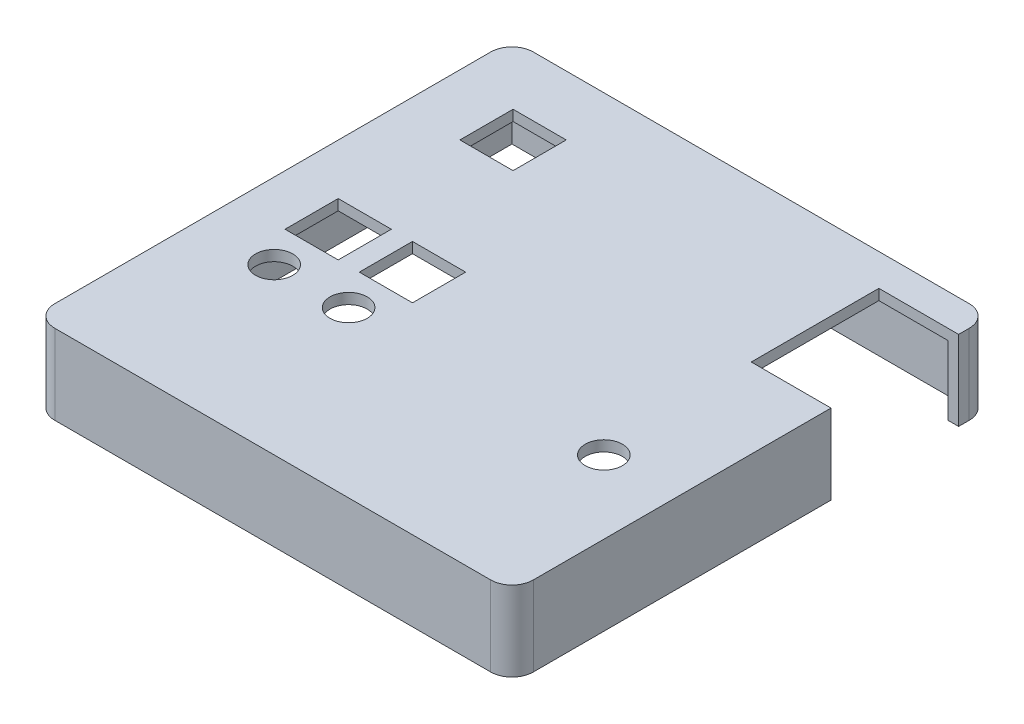
ISO-10303-21;
HEADER;
FILE_DESCRIPTION(('STEP AP214'),'2;1');
FILE_NAME('part.step','',(''),(''),'','','');
FILE_SCHEMA(('AUTOMOTIVE_DESIGN { 1 0 10303 214 1 1 1 1 }'));
ENDSEC;
DATA;
#1=APPLICATION_CONTEXT('core data for automotive mechanical design processes');
#2=APPLICATION_PROTOCOL_DEFINITION('international standard','automotive_design',2000,#1);
#3=PRODUCT_CONTEXT('',#1,'mechanical');
#4=PRODUCT('Part','Part','',(#3));
#5=PRODUCT_RELATED_PRODUCT_CATEGORY('part','',(#4));
#6=PRODUCT_DEFINITION_FORMATION('','',#4);
#7=PRODUCT_DEFINITION_CONTEXT('part definition',#1,'design');
#8=PRODUCT_DEFINITION('design','',#6,#7);
#9=PRODUCT_DEFINITION_SHAPE('','',#8);
#10=(LENGTH_UNIT() NAMED_UNIT(*) SI_UNIT(.MILLI.,.METRE.));
#11=(NAMED_UNIT(*) PLANE_ANGLE_UNIT() SI_UNIT($,.RADIAN.));
#12=(NAMED_UNIT(*) SI_UNIT($,.STERADIAN.) SOLID_ANGLE_UNIT());
#13=UNCERTAINTY_MEASURE_WITH_UNIT(LENGTH_MEASURE(1.E-05),#10,'distance_accuracy_value','');
#14=(GEOMETRIC_REPRESENTATION_CONTEXT(3) GLOBAL_UNCERTAINTY_ASSIGNED_CONTEXT((#13)) GLOBAL_UNIT_ASSIGNED_CONTEXT((#10,
#11,#12)) REPRESENTATION_CONTEXT('',''));
#15=CARTESIAN_POINT('',(0.,0.,0.));
#16=DIRECTION('',(0.,0.,1.));
#17=DIRECTION('',(1.,0.,0.));
#18=AXIS2_PLACEMENT_3D('',#15,#16,#17);
#19=CARTESIAN_POINT('',(0.,-15.,0.));
#20=DIRECTION('',(0.,-1.,0.));
#21=DIRECTION('',(0.,0.,-1.));
#22=AXIS2_PLACEMENT_3D('',#19,#20,#21);
#23=PLANE('',#22);
#24=DIRECTION('',(0.,0.,1.));
#25=VECTOR('',#24,1.);
#26=CARTESIAN_POINT('',(0.,-15.,0.));
#27=LINE('',#26,#25);
#28=CARTESIAN_POINT('',(0.,-15.,-86.));
#29=VERTEX_POINT('',#28);
#30=CARTESIAN_POINT('',(0.,-15.,-4.));
#31=VERTEX_POINT('',#30);
#32=EDGE_CURVE('E453',#29,#31,#27,.T.);
#33=ORIENTED_EDGE('',*,*,#32,.F.);
#34=CARTESIAN_POINT('',(4.,-15.,-86.));
#35=DIRECTION('',(0.,-1.,0.));
#36=DIRECTION('',(0.,0.,-1.));
#37=AXIS2_PLACEMENT_3D('',#34,#35,#36);
#38=CIRCLE('',#37,4.);
#39=CARTESIAN_POINT('',(4.,-15.,-90.));
#40=VERTEX_POINT('',#39);
#41=EDGE_CURVE('E563',#29,#40,#38,.T.);
#42=ORIENTED_EDGE('',*,*,#41,.T.);
#43=DIRECTION('',(-1.,0.,0.));
#44=VECTOR('',#43,1.);
#45=CARTESIAN_POINT('',(0.,-15.,-90.));
#46=LINE('',#45,#44);
#47=CARTESIAN_POINT('',(86.,-15.,-90.));
#48=VERTEX_POINT('',#47);
#49=EDGE_CURVE('E465',#48,#40,#46,.T.);
#50=ORIENTED_EDGE('',*,*,#49,.F.);
#51=CARTESIAN_POINT('',(86.,-15.,-86.));
#52=DIRECTION('',(0.,-1.,0.));
#53=DIRECTION('',(0.,0.,-1.));
#54=AXIS2_PLACEMENT_3D('',#51,#52,#53);
#55=CIRCLE('',#54,4.);
#56=CARTESIAN_POINT('',(90.,-15.,-86.));
#57=VERTEX_POINT('',#56);
#58=EDGE_CURVE('E55',#48,#57,#55,.T.);
#59=ORIENTED_EDGE('',*,*,#58,.T.);
#60=DIRECTION('',(0.,0.,-1.));
#61=VECTOR('',#60,1.);
#62=CARTESIAN_POINT('',(90.,-15.,0.));
#63=LINE('',#62,#61);
#64=CARTESIAN_POINT('',(90.,-15.,-84.));
#65=VERTEX_POINT('',#64);
#66=EDGE_CURVE('E461',#65,#57,#63,.T.);
#67=ORIENTED_EDGE('',*,*,#66,.F.);
#68=DIRECTION('',(1.,0.,0.));
#69=VECTOR('',#68,1.);
#70=CARTESIAN_POINT('',(75.,-15.,-84.));
#71=LINE('',#70,#69);
#72=CARTESIAN_POINT('',(88.,-15.,-84.));
#73=VERTEX_POINT('',#72);
#74=EDGE_CURVE('E447',#73,#65,#71,.T.);
#75=ORIENTED_EDGE('',*,*,#74,.F.);
#76=DIRECTION('',(0.,0.,-1.));
#77=VECTOR('',#76,1.);
#78=CARTESIAN_POINT('',(88.,-15.,0.));
#79=LINE('',#78,#77);
#80=CARTESIAN_POINT('',(88.,-15.,-88.));
#81=VERTEX_POINT('',#80);
#82=EDGE_CURVE('E395',#73,#81,#79,.T.);
#83=ORIENTED_EDGE('',*,*,#82,.T.);
#84=DIRECTION('',(-1.,0.,0.));
#85=VECTOR('',#84,1.);
#86=CARTESIAN_POINT('',(0.,-15.,-88.));
#87=LINE('',#86,#85);
#88=CARTESIAN_POINT('',(2.,-15.,-88.));
#89=VERTEX_POINT('',#88);
#90=EDGE_CURVE('E368',#81,#89,#87,.T.);
#91=ORIENTED_EDGE('',*,*,#90,.T.);
#92=DIRECTION('',(0.,0.,1.));
#93=VECTOR('',#92,1.);
#94=CARTESIAN_POINT('',(2.,-15.,0.));
#95=LINE('',#94,#93);
#96=CARTESIAN_POINT('',(2.,-15.,-2.));
#97=VERTEX_POINT('',#96);
#98=EDGE_CURVE('E380',#89,#97,#95,.T.);
#99=ORIENTED_EDGE('',*,*,#98,.T.);
#100=DIRECTION('',(1.,0.,0.));
#101=VECTOR('',#100,1.);
#102=CARTESIAN_POINT('',(0.,-15.,-2.));
#103=LINE('',#102,#101);
#104=CARTESIAN_POINT('',(88.,-15.,-2.));
#105=VERTEX_POINT('',#104);
#106=EDGE_CURVE('E396',#97,#105,#103,.T.);
#107=ORIENTED_EDGE('',*,*,#106,.T.);
#108=DIRECTION('',(0.,0.,-1.));
#109=VECTOR('',#108,1.);
#110=CARTESIAN_POINT('',(88.,-15.,0.));
#111=LINE('',#110,#109);
#112=CARTESIAN_POINT('',(88.,-15.,-60.));
#113=VERTEX_POINT('',#112);
#114=EDGE_CURVE('E391',#105,#113,#111,.T.);
#115=ORIENTED_EDGE('',*,*,#114,.T.);
#116=DIRECTION('',(1.,0.,0.));
#117=VECTOR('',#116,1.);
#118=CARTESIAN_POINT('',(75.,-15.,-60.));
#119=LINE('',#118,#117);
#120=CARTESIAN_POINT('',(90.,-15.,-60.));
#121=VERTEX_POINT('',#120);
#122=EDGE_CURVE('E432',#113,#121,#119,.T.);
#123=ORIENTED_EDGE('',*,*,#122,.T.);
#124=CARTESIAN_POINT('',(90.,-15.,-4.));
#125=VERTEX_POINT('',#124);
#126=EDGE_CURVE('E462',#125,#121,#63,.T.);
#127=ORIENTED_EDGE('',*,*,#126,.F.);
#128=CARTESIAN_POINT('',(86.,-15.,-4.));
#129=DIRECTION('',(0.,-1.,0.));
#130=DIRECTION('',(0.,0.,-1.));
#131=AXIS2_PLACEMENT_3D('',#128,#129,#130);
#132=CIRCLE('',#131,4.);
#133=CARTESIAN_POINT('',(86.,-15.,0.));
#134=VERTEX_POINT('',#133);
#135=EDGE_CURVE('E62',#125,#134,#132,.T.);
#136=ORIENTED_EDGE('',*,*,#135,.T.);
#137=DIRECTION('',(1.,0.,0.));
#138=VECTOR('',#137,1.);
#139=CARTESIAN_POINT('',(0.,-15.,0.));
#140=LINE('',#139,#138);
#141=CARTESIAN_POINT('',(4.,-15.,0.));
#142=VERTEX_POINT('',#141);
#143=EDGE_CURVE('E457',#142,#134,#140,.T.);
#144=ORIENTED_EDGE('',*,*,#143,.F.);
#145=CARTESIAN_POINT('',(4.,-15.,-4.));
#146=DIRECTION('',(0.,-1.,0.));
#147=DIRECTION('',(0.,0.,-1.));
#148=AXIS2_PLACEMENT_3D('',#145,#146,#147);
#149=CIRCLE('',#148,4.);
#150=EDGE_CURVE('E560',#142,#31,#149,.T.);
#151=ORIENTED_EDGE('',*,*,#150,.T.);
#152=EDGE_LOOP('',(#33,#42,#50,#59,#67,#75,#83,#91,#99,#107,#115,#123,#127,#136,#144,#151));
#153=FACE_BOUND('',#152,.T.);
#154=ADVANCED_FACE('F39',(#153),#23,.T.);
#155=CARTESIAN_POINT('',(75.,0.,-60.));
#156=DIRECTION('',(0.,0.,1.));
#157=DIRECTION('',(1.,0.,0.));
#158=AXIS2_PLACEMENT_3D('',#155,#156,#157);
#159=PLANE('',#158);
#160=DIRECTION('',(0.,-1.,0.));
#161=VECTOR('',#160,1.);
#162=CARTESIAN_POINT('',(88.,-15.,-60.));
#163=LINE('',#162,#161);
#164=CARTESIAN_POINT('',(88.,-2.,-60.));
#165=VERTEX_POINT('',#164);
#166=EDGE_CURVE('E386',#165,#113,#163,.T.);
#167=ORIENTED_EDGE('',*,*,#166,.F.);
#168=DIRECTION('',(1.,0.,0.));
#169=VECTOR('',#168,1.);
#170=CARTESIAN_POINT('',(75.,-2.,-60.));
#171=LINE('',#170,#169);
#172=CARTESIAN_POINT('',(75.,-2.,-60.));
#173=VERTEX_POINT('',#172);
#174=EDGE_CURVE('E372',#173,#165,#171,.T.);
#175=ORIENTED_EDGE('',*,*,#174,.F.);
#176=DIRECTION('',(0.,-1.,0.));
#177=VECTOR('',#176,1.);
#178=CARTESIAN_POINT('',(75.,0.,-60.));
#179=LINE('',#178,#177);
#180=CARTESIAN_POINT('',(75.,0.,-60.));
#181=VERTEX_POINT('',#180);
#182=EDGE_CURVE('E420',#181,#173,#179,.T.);
#183=ORIENTED_EDGE('',*,*,#182,.F.);
#184=DIRECTION('',(1.,0.,0.));
#185=VECTOR('',#184,1.);
#186=CARTESIAN_POINT('',(75.,0.,-60.));
#187=LINE('',#186,#185);
#188=CARTESIAN_POINT('',(90.,0.,-60.));
#189=VERTEX_POINT('',#188);
#190=EDGE_CURVE('E438',#181,#189,#187,.T.);
#191=ORIENTED_EDGE('',*,*,#190,.T.);
#192=DIRECTION('',(0.,-1.,0.));
#193=VECTOR('',#192,1.);
#194=CARTESIAN_POINT('',(90.,0.,-60.));
#195=LINE('',#194,#193);
#196=EDGE_CURVE('E376',#189,#121,#195,.T.);
#197=ORIENTED_EDGE('',*,*,#196,.T.);
#198=ORIENTED_EDGE('',*,*,#122,.F.);
#199=EDGE_LOOP('',(#167,#175,#183,#191,#197,#198));
#200=FACE_BOUND('',#199,.T.);
#201=ADVANCED_FACE('F608',(#200),#159,.F.);
#202=CARTESIAN_POINT('',(75.,0.,-84.));
#203=DIRECTION('',(0.,0.,-1.));
#204=DIRECTION('',(-1.,0.,0.));
#205=AXIS2_PLACEMENT_3D('',#202,#203,#204);
#206=PLANE('',#205);
#207=DIRECTION('',(0.,1.,0.));
#208=VECTOR('',#207,1.);
#209=CARTESIAN_POINT('',(88.,-15.,-84.));
#210=LINE('',#209,#208);
#211=CARTESIAN_POINT('',(88.,-2.,-84.));
#212=VERTEX_POINT('',#211);
#213=EDGE_CURVE('E389',#73,#212,#210,.T.);
#214=ORIENTED_EDGE('',*,*,#213,.F.);
#215=ORIENTED_EDGE('',*,*,#74,.T.);
#216=DIRECTION('',(0.,1.,0.));
#217=VECTOR('',#216,1.);
#218=CARTESIAN_POINT('',(90.,0.,-84.));
#219=LINE('',#218,#217);
#220=CARTESIAN_POINT('',(90.,0.,-84.));
#221=VERTEX_POINT('',#220);
#222=EDGE_CURVE('E425',#65,#221,#219,.T.);
#223=ORIENTED_EDGE('',*,*,#222,.T.);
#224=DIRECTION('',(1.,0.,0.));
#225=VECTOR('',#224,1.);
#226=CARTESIAN_POINT('',(75.,0.,-84.));
#227=LINE('',#226,#225);
#228=CARTESIAN_POINT('',(75.,0.,-84.));
#229=VERTEX_POINT('',#228);
#230=EDGE_CURVE('E443',#229,#221,#227,.T.);
#231=ORIENTED_EDGE('',*,*,#230,.F.);
#232=DIRECTION('',(0.,1.,0.));
#233=VECTOR('',#232,1.);
#234=CARTESIAN_POINT('',(75.,0.,-84.));
#235=LINE('',#234,#233);
#236=CARTESIAN_POINT('',(75.,-2.,-84.));
#237=VERTEX_POINT('',#236);
#238=EDGE_CURVE('E424',#237,#229,#235,.T.);
#239=ORIENTED_EDGE('',*,*,#238,.F.);
#240=DIRECTION('',(1.,0.,0.));
#241=VECTOR('',#240,1.);
#242=CARTESIAN_POINT('',(0.,-2.,-84.));
#243=LINE('',#242,#241);
#244=EDGE_CURVE('E412',#237,#212,#243,.T.);
#245=ORIENTED_EDGE('',*,*,#244,.T.);
#246=EDGE_LOOP('',(#214,#215,#223,#231,#239,#245));
#247=FACE_BOUND('',#246,.T.);
#248=ADVANCED_FACE('F591',(#247),#206,.F.);
#249=CARTESIAN_POINT('',(90.,-15.,0.));
#250=DIRECTION('',(1.,0.,0.));
#251=DIRECTION('',(0.,0.,-1.));
#252=AXIS2_PLACEMENT_3D('',#249,#250,#251);
#253=PLANE('',#252);
#254=DIRECTION('',(0.,0.,-1.));
#255=VECTOR('',#254,1.);
#256=CARTESIAN_POINT('',(90.,0.,0.));
#257=LINE('',#256,#255);
#258=CARTESIAN_POINT('',(90.,0.,-4.));
#259=VERTEX_POINT('',#258);
#260=EDGE_CURVE('E478',#259,#189,#257,.T.);
#261=ORIENTED_EDGE('',*,*,#260,.F.);
#262=DIRECTION('',(0.,1.,0.));
#263=VECTOR('',#262,1.);
#264=CARTESIAN_POINT('',(90.,-15.,-4.));
#265=LINE('',#264,#263);
#266=EDGE_CURVE('E11',#259,#125,#265,.F.);
#267=ORIENTED_EDGE('',*,*,#266,.T.);
#268=ORIENTED_EDGE('',*,*,#126,.T.);
#269=ORIENTED_EDGE('',*,*,#196,.F.);
#270=EDGE_LOOP('',(#261,#267,#268,#269));
#271=FACE_BOUND('',#270,.T.);
#272=ADVANCED_FACE('F652',(#271),#253,.T.);
#273=CARTESIAN_POINT('',(0.,-15.,0.));
#274=DIRECTION('',(-1.,0.,0.));
#275=DIRECTION('',(0.,0.,1.));
#276=AXIS2_PLACEMENT_3D('',#273,#274,#275);
#277=PLANE('',#276);
#278=DIRECTION('',(0.,0.,1.));
#279=VECTOR('',#278,1.);
#280=CARTESIAN_POINT('',(0.,0.,0.));
#281=LINE('',#280,#279);
#282=CARTESIAN_POINT('',(0.,0.,-86.));
#283=VERTEX_POINT('',#282);
#284=CARTESIAN_POINT('',(0.,0.,-4.));
#285=VERTEX_POINT('',#284);
#286=EDGE_CURVE('E442',#283,#285,#281,.T.);
#287=ORIENTED_EDGE('',*,*,#286,.F.);
#288=DIRECTION('',(0.,1.,0.));
#289=VECTOR('',#288,1.);
#290=CARTESIAN_POINT('',(0.,-15.,-86.));
#291=LINE('',#290,#289);
#292=EDGE_CURVE('E553',#283,#29,#291,.F.);
#293=ORIENTED_EDGE('',*,*,#292,.T.);
#294=ORIENTED_EDGE('',*,*,#32,.T.);
#295=DIRECTION('',(0.,1.,0.));
#296=VECTOR('',#295,1.);
#297=CARTESIAN_POINT('',(0.,-15.,-4.));
#298=LINE('',#297,#296);
#299=EDGE_CURVE('E549',#31,#285,#298,.T.);
#300=ORIENTED_EDGE('',*,*,#299,.T.);
#301=EDGE_LOOP('',(#287,#293,#294,#300));
#302=FACE_BOUND('',#301,.T.);
#303=ADVANCED_FACE('F648',(#302),#277,.T.);
#304=CARTESIAN_POINT('',(0.,-15.,-90.));
#305=DIRECTION('',(0.,0.,-1.));
#306=DIRECTION('',(-1.,0.,0.));
#307=AXIS2_PLACEMENT_3D('',#304,#305,#306);
#308=PLANE('',#307);
#309=ORIENTED_EDGE('',*,*,#49,.T.);
#310=DIRECTION('',(0.,1.,0.));
#311=VECTOR('',#310,1.);
#312=CARTESIAN_POINT('',(4.,-15.,-90.));
#313=LINE('',#312,#311);
#314=CARTESIAN_POINT('',(4.,0.,-90.));
#315=VERTEX_POINT('',#314);
#316=EDGE_CURVE('E533',#40,#315,#313,.T.);
#317=ORIENTED_EDGE('',*,*,#316,.T.);
#318=DIRECTION('',(-1.,0.,0.));
#319=VECTOR('',#318,1.);
#320=CARTESIAN_POINT('',(0.,0.,-90.));
#321=LINE('',#320,#319);
#322=CARTESIAN_POINT('',(86.,0.,-90.));
#323=VERTEX_POINT('',#322);
#324=EDGE_CURVE('E458',#323,#315,#321,.T.);
#325=ORIENTED_EDGE('',*,*,#324,.F.);
#326=DIRECTION('',(0.,1.,0.));
#327=VECTOR('',#326,1.);
#328=CARTESIAN_POINT('',(86.,-15.,-90.));
#329=LINE('',#328,#327);
#330=EDGE_CURVE('E530',#323,#48,#329,.F.);
#331=ORIENTED_EDGE('',*,*,#330,.T.);
#332=EDGE_LOOP('',(#309,#317,#325,#331));
#333=FACE_BOUND('',#332,.T.);
#334=ADVANCED_FACE('F645',(#333),#308,.T.);
#335=ORIENTED_EDGE('',*,*,#66,.T.);
#336=DIRECTION('',(0.,1.,0.));
#337=VECTOR('',#336,1.);
#338=CARTESIAN_POINT('',(90.,-15.,-86.));
#339=LINE('',#338,#337);
#340=CARTESIAN_POINT('',(90.,0.,-86.));
#341=VERTEX_POINT('',#340);
#342=EDGE_CURVE('E48',#57,#341,#339,.T.);
#343=ORIENTED_EDGE('',*,*,#342,.T.);
#344=EDGE_CURVE('E477',#221,#341,#257,.T.);
#345=ORIENTED_EDGE('',*,*,#344,.F.);
#346=ORIENTED_EDGE('',*,*,#222,.F.);
#347=EDGE_LOOP('',(#335,#343,#345,#346));
#348=FACE_BOUND('',#347,.T.);
#349=ADVANCED_FACE('F578',(#348),#253,.T.);
#350=CARTESIAN_POINT('',(0.,-15.,0.));
#351=DIRECTION('',(0.,0.,1.));
#352=DIRECTION('',(1.,0.,0.));
#353=AXIS2_PLACEMENT_3D('',#350,#351,#352);
#354=PLANE('',#353);
#355=DIRECTION('',(1.,0.,0.));
#356=VECTOR('',#355,1.);
#357=CARTESIAN_POINT('',(0.,0.,0.));
#358=LINE('',#357,#356);
#359=CARTESIAN_POINT('',(4.,0.,0.));
#360=VERTEX_POINT('',#359);
#361=CARTESIAN_POINT('',(86.,0.,0.));
#362=VERTEX_POINT('',#361);
#363=EDGE_CURVE('E473',#360,#362,#358,.T.);
#364=ORIENTED_EDGE('',*,*,#363,.F.);
#365=DIRECTION('',(0.,1.,0.));
#366=VECTOR('',#365,1.);
#367=CARTESIAN_POINT('',(4.,-15.,0.));
#368=LINE('',#367,#366);
#369=EDGE_CURVE('E570',#360,#142,#368,.F.);
#370=ORIENTED_EDGE('',*,*,#369,.T.);
#371=ORIENTED_EDGE('',*,*,#143,.T.);
#372=DIRECTION('',(0.,1.,0.));
#373=VECTOR('',#372,1.);
#374=CARTESIAN_POINT('',(86.,-15.,0.));
#375=LINE('',#374,#373);
#376=EDGE_CURVE('E566',#134,#362,#375,.T.);
#377=ORIENTED_EDGE('',*,*,#376,.T.);
#378=EDGE_LOOP('',(#364,#370,#371,#377));
#379=FACE_BOUND('',#378,.T.);
#380=ADVANCED_FACE('F643',(#379),#354,.T.);
#381=CARTESIAN_POINT('',(0.,0.,0.));
#382=DIRECTION('',(0.,-1.,0.));
#383=DIRECTION('',(0.,0.,-1.));
#384=AXIS2_PLACEMENT_3D('',#381,#382,#383);
#385=PLANE('',#384);
#386=DIRECTION('',(-1.,0.,0.));
#387=VECTOR('',#386,1.);
#388=CARTESIAN_POINT('',(11.43,0.,-78.77));
#389=LINE('',#388,#387);
#390=CARTESIAN_POINT('',(21.43,0.,-78.77));
#391=VERTEX_POINT('',#390);
#392=CARTESIAN_POINT('',(11.43,0.,-78.77));
#393=VERTEX_POINT('',#392);
#394=EDGE_CURVE('E285',#391,#393,#389,.T.);
#395=ORIENTED_EDGE('',*,*,#394,.F.);
#396=DIRECTION('',(0.,0.,-1.));
#397=VECTOR('',#396,1.);
#398=CARTESIAN_POINT('',(21.43,0.,-68.77));
#399=LINE('',#398,#397);
#400=CARTESIAN_POINT('',(21.43,0.,-68.77));
#401=VERTEX_POINT('',#400);
#402=EDGE_CURVE('E282',#401,#391,#399,.T.);
#403=ORIENTED_EDGE('',*,*,#402,.F.);
#404=DIRECTION('',(1.,0.,0.));
#405=VECTOR('',#404,1.);
#406=CARTESIAN_POINT('',(11.43,0.,-68.77));
#407=LINE('',#406,#405);
#408=CARTESIAN_POINT('',(11.43,0.,-68.77));
#409=VERTEX_POINT('',#408);
#410=EDGE_CURVE('E293',#409,#401,#407,.T.);
#411=ORIENTED_EDGE('',*,*,#410,.F.);
#412=DIRECTION('',(0.,0.,1.));
#413=VECTOR('',#412,1.);
#414=CARTESIAN_POINT('',(11.43,0.,-68.77));
#415=LINE('',#414,#413);
#416=EDGE_CURVE('E289',#393,#409,#415,.T.);
#417=ORIENTED_EDGE('',*,*,#416,.F.);
#418=EDGE_LOOP('',(#395,#403,#411,#417));
#419=FACE_BOUND('',#418,.T.);
#420=DIRECTION('',(-1.,0.,0.));
#421=VECTOR('',#420,1.);
#422=CARTESIAN_POINT('',(23.5,0.,-47.78));
#423=LINE('',#422,#421);
#424=CARTESIAN_POINT('',(33.5,0.,-47.78));
#425=VERTEX_POINT('',#424);
#426=CARTESIAN_POINT('',(23.5,0.,-47.78));
#427=VERTEX_POINT('',#426);
#428=EDGE_CURVE('E256',#425,#427,#423,.T.);
#429=ORIENTED_EDGE('',*,*,#428,.F.);
#430=DIRECTION('',(0.,0.,-1.));
#431=VECTOR('',#430,1.);
#432=CARTESIAN_POINT('',(33.5,0.,-37.78));
#433=LINE('',#432,#431);
#434=CARTESIAN_POINT('',(33.5,0.,-37.78));
#435=VERTEX_POINT('',#434);
#436=EDGE_CURVE('E262',#435,#425,#433,.T.);
#437=ORIENTED_EDGE('',*,*,#436,.F.);
#438=DIRECTION('',(1.,0.,0.));
#439=VECTOR('',#438,1.);
#440=CARTESIAN_POINT('',(23.5,0.,-37.78));
#441=LINE('',#440,#439);
#442=CARTESIAN_POINT('',(23.5,0.,-37.78));
#443=VERTEX_POINT('',#442);
#444=EDGE_CURVE('E267',#443,#435,#441,.T.);
#445=ORIENTED_EDGE('',*,*,#444,.F.);
#446=DIRECTION('',(0.,0.,1.));
#447=VECTOR('',#446,1.);
#448=CARTESIAN_POINT('',(23.5,0.,-37.78));
#449=LINE('',#448,#447);
#450=EDGE_CURVE('E244',#427,#443,#449,.T.);
#451=ORIENTED_EDGE('',*,*,#450,.F.);
#452=EDGE_LOOP('',(#429,#437,#445,#451));
#453=FACE_BOUND('',#452,.T.);
#454=DIRECTION('',(-1.,0.,0.));
#455=VECTOR('',#454,1.);
#456=CARTESIAN_POINT('',(9.53000000000001,0.,-47.78));
#457=LINE('',#456,#455);
#458=CARTESIAN_POINT('',(19.53,0.,-47.78));
#459=VERTEX_POINT('',#458);
#460=CARTESIAN_POINT('',(9.53000000000001,0.,-47.78));
#461=VERTEX_POINT('',#460);
#462=EDGE_CURVE('E312',#459,#461,#457,.T.);
#463=ORIENTED_EDGE('',*,*,#462,.F.);
#464=DIRECTION('',(0.,0.,-1.));
#465=VECTOR('',#464,1.);
#466=CARTESIAN_POINT('',(19.53,0.,-37.78));
#467=LINE('',#466,#465);
#468=CARTESIAN_POINT('',(19.53,0.,-37.78));
#469=VERTEX_POINT('',#468);
#470=EDGE_CURVE('E277',#469,#459,#467,.T.);
#471=ORIENTED_EDGE('',*,*,#470,.F.);
#472=DIRECTION('',(1.,0.,0.));
#473=VECTOR('',#472,1.);
#474=CARTESIAN_POINT('',(9.53000000000001,0.,-37.78));
#475=LINE('',#474,#473);
#476=CARTESIAN_POINT('',(9.53000000000001,0.,-37.78));
#477=VERTEX_POINT('',#476);
#478=EDGE_CURVE('E320',#477,#469,#475,.T.);
#479=ORIENTED_EDGE('',*,*,#478,.F.);
#480=DIRECTION('',(0.,0.,1.));
#481=VECTOR('',#480,1.);
#482=CARTESIAN_POINT('',(9.53000000000001,0.,-37.78));
#483=LINE('',#482,#481);
#484=EDGE_CURVE('E316',#461,#477,#483,.T.);
#485=ORIENTED_EDGE('',*,*,#484,.F.);
#486=EDGE_LOOP('',(#463,#471,#479,#485));
#487=FACE_BOUND('',#486,.T.);
#488=CARTESIAN_POINT('',(14.27,0.,-31.));
#489=DIRECTION('',(0.,1.,0.));
#490=DIRECTION('',(0.,0.,1.));
#491=AXIS2_PLACEMENT_3D('',#488,#489,#490);
#492=CIRCLE('',#491,3.5);
#493=CARTESIAN_POINT('',(14.27,0.,-27.5));
#494=VERTEX_POINT('',#493);
#495=EDGE_CURVE('E338',#494,#494,#492,.T.);
#496=ORIENTED_EDGE('',*,*,#495,.F.);
#497=EDGE_LOOP('',(#496));
#498=FACE_BOUND('',#497,.T.);
#499=CARTESIAN_POINT('',(28.27,0.,-31.));
#500=DIRECTION('',(0.,1.,0.));
#501=DIRECTION('',(0.,0.,1.));
#502=AXIS2_PLACEMENT_3D('',#499,#500,#501);
#503=CIRCLE('',#502,3.5);
#504=CARTESIAN_POINT('',(28.27,0.,-27.5));
#505=VERTEX_POINT('',#504);
#506=EDGE_CURVE('E343',#505,#505,#503,.T.);
#507=ORIENTED_EDGE('',*,*,#506,.F.);
#508=EDGE_LOOP('',(#507));
#509=FACE_BOUND('',#508,.T.);
#510=CARTESIAN_POINT('',(76.27,0.,-31.));
#511=DIRECTION('',(0.,1.,0.));
#512=DIRECTION('',(0.,0.,1.));
#513=AXIS2_PLACEMENT_3D('',#510,#511,#512);
#514=CIRCLE('',#513,3.50000000000001);
#515=CARTESIAN_POINT('',(76.27,0.,-27.5));
#516=VERTEX_POINT('',#515);
#517=EDGE_CURVE('E328',#516,#516,#514,.T.);
#518=ORIENTED_EDGE('',*,*,#517,.F.);
#519=EDGE_LOOP('',(#518));
#520=FACE_BOUND('',#519,.T.);
#521=ORIENTED_EDGE('',*,*,#324,.T.);
#522=CARTESIAN_POINT('',(4.,0.,-86.));
#523=DIRECTION('',(0.,-1.,0.));
#524=DIRECTION('',(0.,0.,-1.));
#525=AXIS2_PLACEMENT_3D('',#522,#523,#524);
#526=CIRCLE('',#525,4.);
#527=EDGE_CURVE('E546',#315,#283,#526,.F.);
#528=ORIENTED_EDGE('',*,*,#527,.T.);
#529=ORIENTED_EDGE('',*,*,#286,.T.);
#530=CARTESIAN_POINT('',(4.,0.,-4.));
#531=DIRECTION('',(0.,-1.,0.));
#532=DIRECTION('',(0.,0.,-1.));
#533=AXIS2_PLACEMENT_3D('',#530,#531,#532);
#534=CIRCLE('',#533,4.);
#535=EDGE_CURVE('E543',#285,#360,#534,.F.);
#536=ORIENTED_EDGE('',*,*,#535,.T.);
#537=ORIENTED_EDGE('',*,*,#363,.T.);
#538=CARTESIAN_POINT('',(86.,0.,-4.));
#539=DIRECTION('',(0.,-1.,0.));
#540=DIRECTION('',(0.,0.,-1.));
#541=AXIS2_PLACEMENT_3D('',#538,#539,#540);
#542=CIRCLE('',#541,4.);
#543=EDGE_CURVE('E537',#362,#259,#542,.F.);
#544=ORIENTED_EDGE('',*,*,#543,.T.);
#545=ORIENTED_EDGE('',*,*,#260,.T.);
#546=ORIENTED_EDGE('',*,*,#190,.F.);
#547=DIRECTION('',(0.,0.,1.));
#548=VECTOR('',#547,1.);
#549=CARTESIAN_POINT('',(75.,0.,-60.));
#550=LINE('',#549,#548);
#551=EDGE_CURVE('E428',#229,#181,#550,.T.);
#552=ORIENTED_EDGE('',*,*,#551,.F.);
#553=ORIENTED_EDGE('',*,*,#230,.T.);
#554=ORIENTED_EDGE('',*,*,#344,.T.);
#555=CARTESIAN_POINT('',(86.,0.,-86.));
#556=DIRECTION('',(0.,-1.,0.));
#557=DIRECTION('',(0.,0.,-1.));
#558=AXIS2_PLACEMENT_3D('',#555,#556,#557);
#559=CIRCLE('',#558,4.);
#560=EDGE_CURVE('E540',#341,#323,#559,.F.);
#561=ORIENTED_EDGE('',*,*,#560,.T.);
#562=EDGE_LOOP('',(#521,#528,#529,#536,#537,#544,#545,#546,#552,#553,#554,#561));
#563=FACE_BOUND('',#562,.T.);
#564=ADVANCED_FACE('F264',(#419,#453,#487,#498,#509,#520,#563),#385,.F.);
#565=CARTESIAN_POINT('',(75.,0.,0.));
#566=DIRECTION('',(1.,0.,0.));
#567=DIRECTION('',(0.,0.,-1.));
#568=AXIS2_PLACEMENT_3D('',#565,#566,#567);
#569=PLANE('',#568);
#570=DIRECTION('',(0.,0.,1.));
#571=VECTOR('',#570,1.);
#572=CARTESIAN_POINT('',(75.,-2.,0.));
#573=LINE('',#572,#571);
#574=EDGE_CURVE('E411',#237,#173,#573,.T.);
#575=ORIENTED_EDGE('',*,*,#574,.F.);
#576=ORIENTED_EDGE('',*,*,#238,.T.);
#577=ORIENTED_EDGE('',*,*,#551,.T.);
#578=ORIENTED_EDGE('',*,*,#182,.T.);
#579=EDGE_LOOP('',(#575,#576,#577,#578));
#580=FACE_BOUND('',#579,.T.);
#581=ADVANCED_FACE('F605',(#580),#569,.T.);
#582=CARTESIAN_POINT('',(88.,-15.,0.));
#583=DIRECTION('',(1.,0.,0.));
#584=DIRECTION('',(0.,0.,-1.));
#585=AXIS2_PLACEMENT_3D('',#582,#583,#584);
#586=PLANE('',#585);
#587=ORIENTED_EDGE('',*,*,#166,.T.);
#588=ORIENTED_EDGE('',*,*,#114,.F.);
#589=DIRECTION('',(0.,1.,0.));
#590=VECTOR('',#589,1.);
#591=CARTESIAN_POINT('',(88.,-15.,-2.));
#592=LINE('',#591,#590);
#593=CARTESIAN_POINT('',(88.,-2.,-2.));
#594=VERTEX_POINT('',#593);
#595=EDGE_CURVE('E356',#105,#594,#592,.T.);
#596=ORIENTED_EDGE('',*,*,#595,.T.);
#597=DIRECTION('',(0.,0.,-1.));
#598=VECTOR('',#597,1.);
#599=CARTESIAN_POINT('',(88.,-2.,0.));
#600=LINE('',#599,#598);
#601=EDGE_CURVE('E350',#594,#165,#600,.T.);
#602=ORIENTED_EDGE('',*,*,#601,.T.);
#603=EDGE_LOOP('',(#587,#588,#596,#602));
#604=FACE_BOUND('',#603,.T.);
#605=ADVANCED_FACE('F613',(#604),#586,.F.);
#606=CARTESIAN_POINT('',(2.,-15.,0.));
#607=DIRECTION('',(-1.,0.,0.));
#608=DIRECTION('',(0.,0.,1.));
#609=AXIS2_PLACEMENT_3D('',#606,#607,#608);
#610=PLANE('',#609);
#611=DIRECTION('',(0.,0.,1.));
#612=VECTOR('',#611,1.);
#613=CARTESIAN_POINT('',(2.,-2.,0.));
#614=LINE('',#613,#612);
#615=CARTESIAN_POINT('',(2.,-2.,-88.));
#616=VERTEX_POINT('',#615);
#617=CARTESIAN_POINT('',(2.,-2.,-2.));
#618=VERTEX_POINT('',#617);
#619=EDGE_CURVE('E365',#616,#618,#614,.T.);
#620=ORIENTED_EDGE('',*,*,#619,.T.);
#621=DIRECTION('',(0.,1.,0.));
#622=VECTOR('',#621,1.);
#623=CARTESIAN_POINT('',(2.,-15.,-2.));
#624=LINE('',#623,#622);
#625=EDGE_CURVE('E360',#97,#618,#624,.T.);
#626=ORIENTED_EDGE('',*,*,#625,.F.);
#627=ORIENTED_EDGE('',*,*,#98,.F.);
#628=DIRECTION('',(0.,1.,0.));
#629=VECTOR('',#628,1.);
#630=CARTESIAN_POINT('',(2.,-15.,-88.));
#631=LINE('',#630,#629);
#632=EDGE_CURVE('E373',#89,#616,#631,.T.);
#633=ORIENTED_EDGE('',*,*,#632,.T.);
#634=EDGE_LOOP('',(#620,#626,#627,#633));
#635=FACE_BOUND('',#634,.T.);
#636=ADVANCED_FACE('F620',(#635),#610,.F.);
#637=CARTESIAN_POINT('',(0.,-15.,-88.));
#638=DIRECTION('',(0.,0.,-1.));
#639=DIRECTION('',(-1.,0.,0.));
#640=AXIS2_PLACEMENT_3D('',#637,#638,#639);
#641=PLANE('',#640);
#642=DIRECTION('',(-1.,0.,0.));
#643=VECTOR('',#642,1.);
#644=CARTESIAN_POINT('',(0.,-2.,-88.));
#645=LINE('',#644,#643);
#646=CARTESIAN_POINT('',(88.,-2.,-88.));
#647=VERTEX_POINT('',#646);
#648=EDGE_CURVE('E354',#647,#616,#645,.T.);
#649=ORIENTED_EDGE('',*,*,#648,.T.);
#650=ORIENTED_EDGE('',*,*,#632,.F.);
#651=ORIENTED_EDGE('',*,*,#90,.F.);
#652=DIRECTION('',(0.,1.,0.));
#653=VECTOR('',#652,1.);
#654=CARTESIAN_POINT('',(88.,-15.,-88.));
#655=LINE('',#654,#653);
#656=EDGE_CURVE('E359',#81,#647,#655,.T.);
#657=ORIENTED_EDGE('',*,*,#656,.T.);
#658=EDGE_LOOP('',(#649,#650,#651,#657));
#659=FACE_BOUND('',#658,.T.);
#660=ADVANCED_FACE('F623',(#659),#641,.F.);
#661=ORIENTED_EDGE('',*,*,#213,.T.);
#662=DIRECTION('',(0.,0.,-1.));
#663=VECTOR('',#662,1.);
#664=CARTESIAN_POINT('',(88.,-2.,0.));
#665=LINE('',#664,#663);
#666=EDGE_CURVE('E355',#212,#647,#665,.T.);
#667=ORIENTED_EDGE('',*,*,#666,.T.);
#668=ORIENTED_EDGE('',*,*,#656,.F.);
#669=ORIENTED_EDGE('',*,*,#82,.F.);
#670=EDGE_LOOP('',(#661,#667,#668,#669));
#671=FACE_BOUND('',#670,.T.);
#672=ADVANCED_FACE('F596',(#671),#586,.F.);
#673=CARTESIAN_POINT('',(0.,-15.,-2.));
#674=DIRECTION('',(0.,0.,1.));
#675=DIRECTION('',(1.,0.,0.));
#676=AXIS2_PLACEMENT_3D('',#673,#674,#675);
#677=PLANE('',#676);
#678=DIRECTION('',(1.,0.,0.));
#679=VECTOR('',#678,1.);
#680=CARTESIAN_POINT('',(0.,-2.,-2.));
#681=LINE('',#680,#679);
#682=EDGE_CURVE('E361',#618,#594,#681,.T.);
#683=ORIENTED_EDGE('',*,*,#682,.T.);
#684=ORIENTED_EDGE('',*,*,#595,.F.);
#685=ORIENTED_EDGE('',*,*,#106,.F.);
#686=ORIENTED_EDGE('',*,*,#625,.T.);
#687=EDGE_LOOP('',(#683,#684,#685,#686));
#688=FACE_BOUND('',#687,.T.);
#689=ADVANCED_FACE('F617',(#688),#677,.F.);
#690=CARTESIAN_POINT('',(0.,-2.,0.));
#691=DIRECTION('',(0.,-1.,0.));
#692=DIRECTION('',(0.,0.,-1.));
#693=AXIS2_PLACEMENT_3D('',#690,#691,#692);
#694=PLANE('',#693);
#695=DIRECTION('',(0.,0.,1.));
#696=VECTOR('',#695,1.);
#697=CARTESIAN_POINT('',(21.43,-2.,0.));
#698=LINE('',#697,#696);
#699=CARTESIAN_POINT('',(21.43,-2.,-78.77));
#700=VERTEX_POINT('',#699);
#701=CARTESIAN_POINT('',(21.43,-2.,-68.77));
#702=VERTEX_POINT('',#701);
#703=EDGE_CURVE('E527',#700,#702,#698,.T.);
#704=ORIENTED_EDGE('',*,*,#703,.F.);
#705=DIRECTION('',(1.,0.,0.));
#706=VECTOR('',#705,1.);
#707=CARTESIAN_POINT('',(0.,-2.,-78.77));
#708=LINE('',#707,#706);
#709=CARTESIAN_POINT('',(11.43,-2.,-78.77));
#710=VERTEX_POINT('',#709);
#711=EDGE_CURVE('E517',#710,#700,#708,.T.);
#712=ORIENTED_EDGE('',*,*,#711,.F.);
#713=DIRECTION('',(0.,0.,-1.));
#714=VECTOR('',#713,1.);
#715=CARTESIAN_POINT('',(11.43,-2.,0.));
#716=LINE('',#715,#714);
#717=CARTESIAN_POINT('',(11.43,-2.,-68.77));
#718=VERTEX_POINT('',#717);
#719=EDGE_CURVE('E520',#718,#710,#716,.T.);
#720=ORIENTED_EDGE('',*,*,#719,.F.);
#721=DIRECTION('',(-1.,0.,0.));
#722=VECTOR('',#721,1.);
#723=CARTESIAN_POINT('',(0.,-2.,-68.77));
#724=LINE('',#723,#722);
#725=EDGE_CURVE('E524',#702,#718,#724,.T.);
#726=ORIENTED_EDGE('',*,*,#725,.F.);
#727=EDGE_LOOP('',(#704,#712,#720,#726));
#728=FACE_BOUND('',#727,.T.);
#729=DIRECTION('',(0.,0.,1.));
#730=VECTOR('',#729,1.);
#731=CARTESIAN_POINT('',(33.5,-2.,0.));
#732=LINE('',#731,#730);
#733=CARTESIAN_POINT('',(33.5,-2.,-47.78));
#734=VERTEX_POINT('',#733);
#735=CARTESIAN_POINT('',(33.5,-2.,-37.78));
#736=VERTEX_POINT('',#735);
#737=EDGE_CURVE('E514',#734,#736,#732,.T.);
#738=ORIENTED_EDGE('',*,*,#737,.F.);
#739=DIRECTION('',(1.,0.,0.));
#740=VECTOR('',#739,1.);
#741=CARTESIAN_POINT('',(0.,-2.,-47.78));
#742=LINE('',#741,#740);
#743=CARTESIAN_POINT('',(23.5,-2.,-47.78));
#744=VERTEX_POINT('',#743);
#745=EDGE_CURVE('E506',#744,#734,#742,.T.);
#746=ORIENTED_EDGE('',*,*,#745,.F.);
#747=DIRECTION('',(0.,0.,-1.));
#748=VECTOR('',#747,1.);
#749=CARTESIAN_POINT('',(23.5,-2.,0.));
#750=LINE('',#749,#748);
#751=CARTESIAN_POINT('',(23.5,-2.,-37.78));
#752=VERTEX_POINT('',#751);
#753=EDGE_CURVE('E247',#752,#744,#750,.T.);
#754=ORIENTED_EDGE('',*,*,#753,.F.);
#755=DIRECTION('',(-1.,0.,0.));
#756=VECTOR('',#755,1.);
#757=CARTESIAN_POINT('',(0.,-2.,-37.78));
#758=LINE('',#757,#756);
#759=EDGE_CURVE('E511',#736,#752,#758,.T.);
#760=ORIENTED_EDGE('',*,*,#759,.F.);
#761=EDGE_LOOP('',(#738,#746,#754,#760));
#762=FACE_BOUND('',#761,.T.);
#763=DIRECTION('',(0.,0.,1.));
#764=VECTOR('',#763,1.);
#765=CARTESIAN_POINT('',(19.5300000000001,-2.,0.));
#766=LINE('',#765,#764);
#767=CARTESIAN_POINT('',(19.53,-2.,-47.78));
#768=VERTEX_POINT('',#767);
#769=CARTESIAN_POINT('',(19.53,-2.,-37.78));
#770=VERTEX_POINT('',#769);
#771=EDGE_CURVE('E503',#768,#770,#766,.T.);
#772=ORIENTED_EDGE('',*,*,#771,.F.);
#773=DIRECTION('',(1.,0.,0.));
#774=VECTOR('',#773,1.);
#775=CARTESIAN_POINT('',(0.,-2.,-47.78));
#776=LINE('',#775,#774);
#777=CARTESIAN_POINT('',(9.53000000000001,-2.,-47.78));
#778=VERTEX_POINT('',#777);
#779=EDGE_CURVE('E469',#778,#768,#776,.T.);
#780=ORIENTED_EDGE('',*,*,#779,.F.);
#781=DIRECTION('',(0.,0.,-1.));
#782=VECTOR('',#781,1.);
#783=CARTESIAN_POINT('',(9.53000000000001,-2.,0.));
#784=LINE('',#783,#782);
#785=CARTESIAN_POINT('',(9.53000000000001,-2.,-37.78));
#786=VERTEX_POINT('',#785);
#787=EDGE_CURVE('E496',#786,#778,#784,.T.);
#788=ORIENTED_EDGE('',*,*,#787,.F.);
#789=DIRECTION('',(-1.,0.,0.));
#790=VECTOR('',#789,1.);
#791=CARTESIAN_POINT('',(0.,-2.,-37.78));
#792=LINE('',#791,#790);
#793=EDGE_CURVE('E500',#770,#786,#792,.T.);
#794=ORIENTED_EDGE('',*,*,#793,.F.);
#795=EDGE_LOOP('',(#772,#780,#788,#794));
#796=FACE_BOUND('',#795,.T.);
#797=CARTESIAN_POINT('',(14.27,-2.,-31.));
#798=DIRECTION('',(0.,-1.,0.));
#799=DIRECTION('',(0.,0.,-1.));
#800=AXIS2_PLACEMENT_3D('',#797,#798,#799);
#801=CIRCLE('',#800,3.5);
#802=CARTESIAN_POINT('',(14.27,-2.,-34.5));
#803=VERTEX_POINT('',#802);
#804=EDGE_CURVE('E390',#803,#803,#801,.T.);
#805=ORIENTED_EDGE('',*,*,#804,.F.);
#806=EDGE_LOOP('',(#805));
#807=FACE_BOUND('',#806,.T.);
#808=CARTESIAN_POINT('',(28.27,-2.,-31.));
#809=DIRECTION('',(0.,-1.,0.));
#810=DIRECTION('',(0.,0.,-1.));
#811=AXIS2_PLACEMENT_3D('',#808,#809,#810);
#812=CIRCLE('',#811,3.5);
#813=CARTESIAN_POINT('',(28.27,-2.,-34.5));
#814=VERTEX_POINT('',#813);
#815=EDGE_CURVE('E487',#814,#814,#812,.T.);
#816=ORIENTED_EDGE('',*,*,#815,.F.);
#817=EDGE_LOOP('',(#816));
#818=FACE_BOUND('',#817,.T.);
#819=CARTESIAN_POINT('',(76.27,-2.,-31.));
#820=DIRECTION('',(0.,-1.,0.));
#821=DIRECTION('',(0.,0.,-1.));
#822=AXIS2_PLACEMENT_3D('',#819,#820,#821);
#823=CIRCLE('',#822,3.50000000000001);
#824=CARTESIAN_POINT('',(76.27,-2.,-34.5));
#825=VERTEX_POINT('',#824);
#826=EDGE_CURVE('E342',#825,#825,#823,.T.);
#827=ORIENTED_EDGE('',*,*,#826,.F.);
#828=EDGE_LOOP('',(#827));
#829=FACE_BOUND('',#828,.T.);
#830=ORIENTED_EDGE('',*,*,#601,.F.);
#831=ORIENTED_EDGE('',*,*,#682,.F.);
#832=ORIENTED_EDGE('',*,*,#619,.F.);
#833=ORIENTED_EDGE('',*,*,#648,.F.);
#834=ORIENTED_EDGE('',*,*,#666,.F.);
#835=ORIENTED_EDGE('',*,*,#244,.F.);
#836=ORIENTED_EDGE('',*,*,#574,.T.);
#837=ORIENTED_EDGE('',*,*,#174,.T.);
#838=EDGE_LOOP('',(#830,#831,#832,#833,#834,#835,#836,#837));
#839=FACE_BOUND('',#838,.T.);
#840=ADVANCED_FACE('F601',(#728,#762,#796,#807,#818,#829,#839),#694,.T.);
#841=CARTESIAN_POINT('',(76.27,-4.,-31.));
#842=DIRECTION('',(0.,1.,0.));
#843=DIRECTION('',(0.,0.,1.));
#844=AXIS2_PLACEMENT_3D('',#841,#842,#843);
#845=CYLINDRICAL_SURFACE('',#844,3.50000000000001);
#846=ORIENTED_EDGE('',*,*,#826,.T.);
#847=EDGE_LOOP('',(#846));
#848=FACE_BOUND('',#847,.T.);
#849=ORIENTED_EDGE('',*,*,#517,.T.);
#850=EDGE_LOOP('',(#849));
#851=FACE_BOUND('',#850,.T.);
#852=ADVANCED_FACE('F696',(#848,#851),#845,.F.);
#853=CARTESIAN_POINT('',(28.27,-4.,-31.));
#854=DIRECTION('',(0.,1.,0.));
#855=DIRECTION('',(0.,0.,1.));
#856=AXIS2_PLACEMENT_3D('',#853,#854,#855);
#857=CYLINDRICAL_SURFACE('',#856,3.5);
#858=ORIENTED_EDGE('',*,*,#815,.T.);
#859=EDGE_LOOP('',(#858));
#860=FACE_BOUND('',#859,.T.);
#861=ORIENTED_EDGE('',*,*,#506,.T.);
#862=EDGE_LOOP('',(#861));
#863=FACE_BOUND('',#862,.T.);
#864=ADVANCED_FACE('F715',(#860,#863),#857,.F.);
#865=CARTESIAN_POINT('',(14.27,-4.,-31.));
#866=DIRECTION('',(0.,1.,0.));
#867=DIRECTION('',(0.,0.,1.));
#868=AXIS2_PLACEMENT_3D('',#865,#866,#867);
#869=CYLINDRICAL_SURFACE('',#868,3.5);
#870=ORIENTED_EDGE('',*,*,#804,.T.);
#871=EDGE_LOOP('',(#870));
#872=FACE_BOUND('',#871,.T.);
#873=ORIENTED_EDGE('',*,*,#495,.T.);
#874=EDGE_LOOP('',(#873));
#875=FACE_BOUND('',#874,.T.);
#876=ADVANCED_FACE('F723',(#872,#875),#869,.F.);
#877=CARTESIAN_POINT('',(19.53,-4.,-37.78));
#878=DIRECTION('',(1.,0.,0.));
#879=DIRECTION('',(0.,0.,-1.));
#880=AXIS2_PLACEMENT_3D('',#877,#878,#879);
#881=PLANE('',#880);
#882=ORIENTED_EDGE('',*,*,#771,.T.);
#883=DIRECTION('',(0.,1.,0.));
#884=VECTOR('',#883,1.);
#885=CARTESIAN_POINT('',(19.53,-4.,-37.78));
#886=LINE('',#885,#884);
#887=EDGE_CURVE('E325',#770,#469,#886,.T.);
#888=ORIENTED_EDGE('',*,*,#887,.T.);
#889=ORIENTED_EDGE('',*,*,#470,.T.);
#890=DIRECTION('',(0.,1.,0.));
#891=VECTOR('',#890,1.);
#892=CARTESIAN_POINT('',(19.53,-4.,-47.78));
#893=LINE('',#892,#891);
#894=EDGE_CURVE('E324',#768,#459,#893,.T.);
#895=ORIENTED_EDGE('',*,*,#894,.F.);
#896=EDGE_LOOP('',(#882,#888,#889,#895));
#897=FACE_BOUND('',#896,.T.);
#898=ADVANCED_FACE('F730',(#897),#881,.F.);
#899=CARTESIAN_POINT('',(9.53000000000001,-4.,-37.78));
#900=DIRECTION('',(0.,0.,1.));
#901=DIRECTION('',(1.,0.,0.));
#902=AXIS2_PLACEMENT_3D('',#899,#900,#901);
#903=PLANE('',#902);
#904=ORIENTED_EDGE('',*,*,#793,.T.);
#905=DIRECTION('',(0.,1.,0.));
#906=VECTOR('',#905,1.);
#907=CARTESIAN_POINT('',(9.53000000000001,-4.,-37.78));
#908=LINE('',#907,#906);
#909=EDGE_CURVE('E329',#786,#477,#908,.T.);
#910=ORIENTED_EDGE('',*,*,#909,.T.);
#911=ORIENTED_EDGE('',*,*,#478,.T.);
#912=ORIENTED_EDGE('',*,*,#887,.F.);
#913=EDGE_LOOP('',(#904,#910,#911,#912));
#914=FACE_BOUND('',#913,.T.);
#915=ADVANCED_FACE('F737',(#914),#903,.F.);
#916=CARTESIAN_POINT('',(9.53000000000001,-4.,-37.78));
#917=DIRECTION('',(-1.,0.,0.));
#918=DIRECTION('',(0.,0.,1.));
#919=AXIS2_PLACEMENT_3D('',#916,#917,#918);
#920=PLANE('',#919);
#921=ORIENTED_EDGE('',*,*,#787,.T.);
#922=DIRECTION('',(0.,1.,0.));
#923=VECTOR('',#922,1.);
#924=CARTESIAN_POINT('',(9.53000000000001,-4.,-47.78));
#925=LINE('',#924,#923);
#926=EDGE_CURVE('E332',#778,#461,#925,.T.);
#927=ORIENTED_EDGE('',*,*,#926,.T.);
#928=ORIENTED_EDGE('',*,*,#484,.T.);
#929=ORIENTED_EDGE('',*,*,#909,.F.);
#930=EDGE_LOOP('',(#921,#927,#928,#929));
#931=FACE_BOUND('',#930,.T.);
#932=ADVANCED_FACE('F745',(#931),#920,.F.);
#933=CARTESIAN_POINT('',(9.53000000000001,-4.,-47.78));
#934=DIRECTION('',(0.,0.,-1.));
#935=DIRECTION('',(-1.,0.,0.));
#936=AXIS2_PLACEMENT_3D('',#933,#934,#935);
#937=PLANE('',#936);
#938=ORIENTED_EDGE('',*,*,#779,.T.);
#939=ORIENTED_EDGE('',*,*,#894,.T.);
#940=ORIENTED_EDGE('',*,*,#462,.T.);
#941=ORIENTED_EDGE('',*,*,#926,.F.);
#942=EDGE_LOOP('',(#938,#939,#940,#941));
#943=FACE_BOUND('',#942,.T.);
#944=ADVANCED_FACE('F753',(#943),#937,.F.);
#945=CARTESIAN_POINT('',(33.5,-4.,-37.78));
#946=DIRECTION('',(1.,0.,0.));
#947=DIRECTION('',(0.,0.,-1.));
#948=AXIS2_PLACEMENT_3D('',#945,#946,#947);
#949=PLANE('',#948);
#950=ORIENTED_EDGE('',*,*,#737,.T.);
#951=DIRECTION('',(0.,1.,0.));
#952=VECTOR('',#951,1.);
#953=CARTESIAN_POINT('',(33.5,-4.,-37.78));
#954=LINE('',#953,#952);
#955=EDGE_CURVE('E274',#736,#435,#954,.T.);
#956=ORIENTED_EDGE('',*,*,#955,.T.);
#957=ORIENTED_EDGE('',*,*,#436,.T.);
#958=DIRECTION('',(0.,1.,0.));
#959=VECTOR('',#958,1.);
#960=CARTESIAN_POINT('',(33.5,-4.,-47.78));
#961=LINE('',#960,#959);
#962=EDGE_CURVE('E252',#734,#425,#961,.T.);
#963=ORIENTED_EDGE('',*,*,#962,.F.);
#964=EDGE_LOOP('',(#950,#956,#957,#963));
#965=FACE_BOUND('',#964,.T.);
#966=ADVANCED_FACE('F761',(#965),#949,.F.);
#967=CARTESIAN_POINT('',(23.5,-4.,-37.78));
#968=DIRECTION('',(0.,0.,1.));
#969=DIRECTION('',(1.,0.,0.));
#970=AXIS2_PLACEMENT_3D('',#967,#968,#969);
#971=PLANE('',#970);
#972=ORIENTED_EDGE('',*,*,#759,.T.);
#973=DIRECTION('',(0.,1.,0.));
#974=VECTOR('',#973,1.);
#975=CARTESIAN_POINT('',(23.5,-4.,-37.78));
#976=LINE('',#975,#974);
#977=EDGE_CURVE('E251',#752,#443,#976,.T.);
#978=ORIENTED_EDGE('',*,*,#977,.T.);
#979=ORIENTED_EDGE('',*,*,#444,.T.);
#980=ORIENTED_EDGE('',*,*,#955,.F.);
#981=EDGE_LOOP('',(#972,#978,#979,#980));
#982=FACE_BOUND('',#981,.T.);
#983=ADVANCED_FACE('F769',(#982),#971,.F.);
#984=CARTESIAN_POINT('',(23.5,-4.,-37.78));
#985=DIRECTION('',(-1.,0.,0.));
#986=DIRECTION('',(0.,0.,1.));
#987=AXIS2_PLACEMENT_3D('',#984,#985,#986);
#988=PLANE('',#987);
#989=ORIENTED_EDGE('',*,*,#753,.T.);
#990=DIRECTION('',(0.,1.,0.));
#991=VECTOR('',#990,1.);
#992=CARTESIAN_POINT('',(23.5,-4.,-47.78));
#993=LINE('',#992,#991);
#994=EDGE_CURVE('E239',#744,#427,#993,.T.);
#995=ORIENTED_EDGE('',*,*,#994,.T.);
#996=ORIENTED_EDGE('',*,*,#450,.T.);
#997=ORIENTED_EDGE('',*,*,#977,.F.);
#998=EDGE_LOOP('',(#989,#995,#996,#997));
#999=FACE_BOUND('',#998,.T.);
#1000=ADVANCED_FACE('F241',(#999),#988,.F.);
#1001=CARTESIAN_POINT('',(23.5,-4.,-47.78));
#1002=DIRECTION('',(0.,0.,-1.));
#1003=DIRECTION('',(-1.,0.,0.));
#1004=AXIS2_PLACEMENT_3D('',#1001,#1002,#1003);
#1005=PLANE('',#1004);
#1006=ORIENTED_EDGE('',*,*,#745,.T.);
#1007=ORIENTED_EDGE('',*,*,#962,.T.);
#1008=ORIENTED_EDGE('',*,*,#428,.T.);
#1009=ORIENTED_EDGE('',*,*,#994,.F.);
#1010=EDGE_LOOP('',(#1006,#1007,#1008,#1009));
#1011=FACE_BOUND('',#1010,.T.);
#1012=ADVANCED_FACE('F257',(#1011),#1005,.F.);
#1013=CARTESIAN_POINT('',(21.43,-4.,-68.77));
#1014=DIRECTION('',(1.,0.,0.));
#1015=DIRECTION('',(0.,0.,-1.));
#1016=AXIS2_PLACEMENT_3D('',#1013,#1014,#1015);
#1017=PLANE('',#1016);
#1018=ORIENTED_EDGE('',*,*,#703,.T.);
#1019=DIRECTION('',(0.,1.,0.));
#1020=VECTOR('',#1019,1.);
#1021=CARTESIAN_POINT('',(21.43,-4.,-68.77));
#1022=LINE('',#1021,#1020);
#1023=EDGE_CURVE('E298',#702,#401,#1022,.T.);
#1024=ORIENTED_EDGE('',*,*,#1023,.T.);
#1025=ORIENTED_EDGE('',*,*,#402,.T.);
#1026=DIRECTION('',(0.,1.,0.));
#1027=VECTOR('',#1026,1.);
#1028=CARTESIAN_POINT('',(21.43,-4.,-78.77));
#1029=LINE('',#1028,#1027);
#1030=EDGE_CURVE('E297',#700,#391,#1029,.T.);
#1031=ORIENTED_EDGE('',*,*,#1030,.F.);
#1032=EDGE_LOOP('',(#1018,#1024,#1025,#1031));
#1033=FACE_BOUND('',#1032,.T.);
#1034=ADVANCED_FACE('F790',(#1033),#1017,.F.);
#1035=CARTESIAN_POINT('',(11.43,-4.,-68.77));
#1036=DIRECTION('',(0.,0.,1.));
#1037=DIRECTION('',(1.,0.,0.));
#1038=AXIS2_PLACEMENT_3D('',#1035,#1036,#1037);
#1039=PLANE('',#1038);
#1040=ORIENTED_EDGE('',*,*,#725,.T.);
#1041=DIRECTION('',(0.,1.,0.));
#1042=VECTOR('',#1041,1.);
#1043=CARTESIAN_POINT('',(11.43,-4.,-68.77));
#1044=LINE('',#1043,#1042);
#1045=EDGE_CURVE('E301',#718,#409,#1044,.T.);
#1046=ORIENTED_EDGE('',*,*,#1045,.T.);
#1047=ORIENTED_EDGE('',*,*,#410,.T.);
#1048=ORIENTED_EDGE('',*,*,#1023,.F.);
#1049=EDGE_LOOP('',(#1040,#1046,#1047,#1048));
#1050=FACE_BOUND('',#1049,.T.);
#1051=ADVANCED_FACE('F797',(#1050),#1039,.F.);
#1052=CARTESIAN_POINT('',(11.43,-4.,-68.77));
#1053=DIRECTION('',(-1.,0.,0.));
#1054=DIRECTION('',(0.,0.,1.));
#1055=AXIS2_PLACEMENT_3D('',#1052,#1053,#1054);
#1056=PLANE('',#1055);
#1057=ORIENTED_EDGE('',*,*,#719,.T.);
#1058=DIRECTION('',(0.,1.,0.));
#1059=VECTOR('',#1058,1.);
#1060=CARTESIAN_POINT('',(11.43,-4.,-78.77));
#1061=LINE('',#1060,#1059);
#1062=EDGE_CURVE('E304',#710,#393,#1061,.T.);
#1063=ORIENTED_EDGE('',*,*,#1062,.T.);
#1064=ORIENTED_EDGE('',*,*,#416,.T.);
#1065=ORIENTED_EDGE('',*,*,#1045,.F.);
#1066=EDGE_LOOP('',(#1057,#1063,#1064,#1065));
#1067=FACE_BOUND('',#1066,.T.);
#1068=ADVANCED_FACE('F805',(#1067),#1056,.F.);
#1069=CARTESIAN_POINT('',(11.43,-4.,-78.77));
#1070=DIRECTION('',(0.,0.,-1.));
#1071=DIRECTION('',(-1.,0.,0.));
#1072=AXIS2_PLACEMENT_3D('',#1069,#1070,#1071);
#1073=PLANE('',#1072);
#1074=ORIENTED_EDGE('',*,*,#711,.T.);
#1075=ORIENTED_EDGE('',*,*,#1030,.T.);
#1076=ORIENTED_EDGE('',*,*,#394,.T.);
#1077=ORIENTED_EDGE('',*,*,#1062,.F.);
#1078=EDGE_LOOP('',(#1074,#1075,#1076,#1077));
#1079=FACE_BOUND('',#1078,.T.);
#1080=ADVANCED_FACE('F663',(#1079),#1073,.F.);
#1081=CARTESIAN_POINT('',(4.,-15.,-86.));
#1082=DIRECTION('',(0.,1.,0.));
#1083=DIRECTION('',(0.,0.,1.));
#1084=AXIS2_PLACEMENT_3D('',#1081,#1082,#1083);
#1085=CYLINDRICAL_SURFACE('',#1084,4.);
#1086=ORIENTED_EDGE('',*,*,#41,.F.);
#1087=ORIENTED_EDGE('',*,*,#292,.F.);
#1088=ORIENTED_EDGE('',*,*,#527,.F.);
#1089=ORIENTED_EDGE('',*,*,#316,.F.);
#1090=EDGE_LOOP('',(#1086,#1087,#1088,#1089));
#1091=FACE_BOUND('',#1090,.T.);
#1092=ADVANCED_FACE('F659',(#1091),#1085,.T.);
#1093=CARTESIAN_POINT('',(4.,-15.,-4.));
#1094=DIRECTION('',(0.,1.,0.));
#1095=DIRECTION('',(0.,0.,1.));
#1096=AXIS2_PLACEMENT_3D('',#1093,#1094,#1095);
#1097=CYLINDRICAL_SURFACE('',#1096,4.);
#1098=ORIENTED_EDGE('',*,*,#150,.F.);
#1099=ORIENTED_EDGE('',*,*,#369,.F.);
#1100=ORIENTED_EDGE('',*,*,#535,.F.);
#1101=ORIENTED_EDGE('',*,*,#299,.F.);
#1102=EDGE_LOOP('',(#1098,#1099,#1100,#1101));
#1103=FACE_BOUND('',#1102,.T.);
#1104=ADVANCED_FACE('F662',(#1103),#1097,.T.);
#1105=CARTESIAN_POINT('',(86.,-15.,-86.));
#1106=DIRECTION('',(0.,1.,0.));
#1107=DIRECTION('',(0.,0.,1.));
#1108=AXIS2_PLACEMENT_3D('',#1105,#1106,#1107);
#1109=CYLINDRICAL_SURFACE('',#1108,4.);
#1110=ORIENTED_EDGE('',*,*,#58,.F.);
#1111=ORIENTED_EDGE('',*,*,#330,.F.);
#1112=ORIENTED_EDGE('',*,*,#560,.F.);
#1113=ORIENTED_EDGE('',*,*,#342,.F.);
#1114=EDGE_LOOP('',(#1110,#1111,#1112,#1113));
#1115=FACE_BOUND('',#1114,.T.);
#1116=ADVANCED_FACE('F666',(#1115),#1109,.T.);
#1117=CARTESIAN_POINT('',(86.,-15.,-4.));
#1118=DIRECTION('',(0.,1.,0.));
#1119=DIRECTION('',(0.,0.,1.));
#1120=AXIS2_PLACEMENT_3D('',#1117,#1118,#1119);
#1121=CYLINDRICAL_SURFACE('',#1120,4.);
#1122=ORIENTED_EDGE('',*,*,#135,.F.);
#1123=ORIENTED_EDGE('',*,*,#266,.F.);
#1124=ORIENTED_EDGE('',*,*,#543,.F.);
#1125=ORIENTED_EDGE('',*,*,#376,.F.);
#1126=EDGE_LOOP('',(#1122,#1123,#1124,#1125));
#1127=FACE_BOUND('',#1126,.T.);
#1128=ADVANCED_FACE('F41',(#1127),#1121,.T.);
#1129=CLOSED_SHELL('',(#154,#201,#248,#272,#303,#334,#349,#380,#564,#581,#605,#636,#660,#672,
#689,#840,#852,#864,#876,#898,#915,#932,#944,#966,#983,#1000,#1012,#1034,#1051,#1068,#1080,
#1092,#1104,#1116,#1128));
#1130=MANIFOLD_SOLID_BREP('B2',#1129);
#1131=ADVANCED_BREP_SHAPE_REPRESENTATION('',(#18,#1130),#14);
#1132=SHAPE_DEFINITION_REPRESENTATION(#9,#1131);
ENDSEC;
END-ISO-10303-21;
